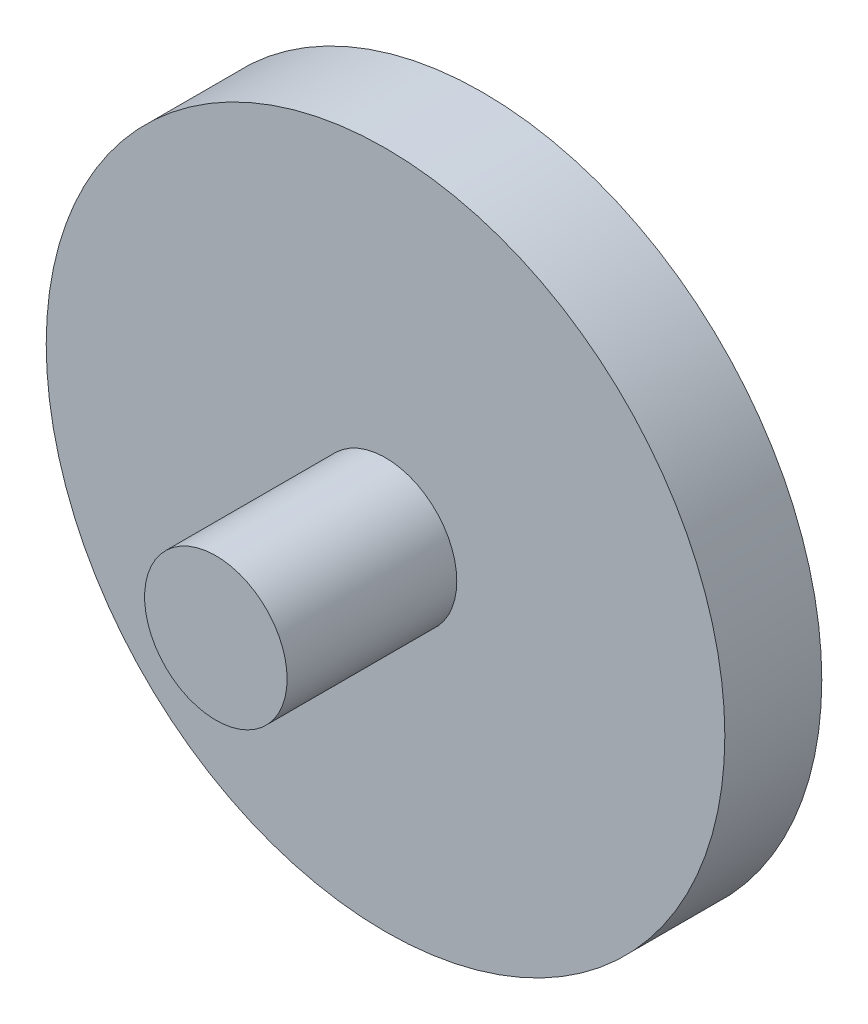
ISO-10303-21;
HEADER;
FILE_DESCRIPTION(('STEP AP214'),'2;1');
FILE_NAME('part.step','',(''),(''),'','','');
FILE_SCHEMA(('AUTOMOTIVE_DESIGN { 1 0 10303 214 1 1 1 1 }'));
ENDSEC;
DATA;
#1=APPLICATION_CONTEXT('core data for automotive mechanical design processes');
#2=APPLICATION_PROTOCOL_DEFINITION('international standard','automotive_design',2000,#1);
#3=PRODUCT_CONTEXT('',#1,'mechanical');
#4=PRODUCT('Part','Part','',(#3));
#5=PRODUCT_RELATED_PRODUCT_CATEGORY('part','',(#4));
#6=PRODUCT_DEFINITION_FORMATION('','',#4);
#7=PRODUCT_DEFINITION_CONTEXT('part definition',#1,'design');
#8=PRODUCT_DEFINITION('design','',#6,#7);
#9=PRODUCT_DEFINITION_SHAPE('','',#8);
#10=(LENGTH_UNIT() NAMED_UNIT(*) SI_UNIT(.MILLI.,.METRE.));
#11=(NAMED_UNIT(*) PLANE_ANGLE_UNIT() SI_UNIT($,.RADIAN.));
#12=(NAMED_UNIT(*) SI_UNIT($,.STERADIAN.) SOLID_ANGLE_UNIT());
#13=UNCERTAINTY_MEASURE_WITH_UNIT(LENGTH_MEASURE(1.E-05),#10,'distance_accuracy_value','');
#14=(GEOMETRIC_REPRESENTATION_CONTEXT(3) GLOBAL_UNCERTAINTY_ASSIGNED_CONTEXT((#13)) GLOBAL_UNIT_ASSIGNED_CONTEXT((#10,
#11,#12)) REPRESENTATION_CONTEXT('',''));
#15=CARTESIAN_POINT('',(0.,0.,0.));
#16=DIRECTION('',(0.,0.,1.));
#17=DIRECTION('',(1.,0.,0.));
#18=AXIS2_PLACEMENT_3D('',#15,#16,#17);
#19=CARTESIAN_POINT('',(0.,0.,4.));
#20=DIRECTION('',(0.,0.,-1.));
#21=DIRECTION('',(-1.,0.,0.));
#22=AXIS2_PLACEMENT_3D('',#19,#20,#21);
#23=CYLINDRICAL_SURFACE('',#22,14.);
#24=CARTESIAN_POINT('',(0.,0.,4.));
#25=DIRECTION('',(0.,0.,1.));
#26=DIRECTION('',(1.,0.,0.));
#27=AXIS2_PLACEMENT_3D('',#24,#25,#26);
#28=CIRCLE('',#27,14.);
#29=CARTESIAN_POINT('',(14.,0.,4.));
#30=VERTEX_POINT('',#29);
#31=EDGE_CURVE('E43',#30,#30,#28,.T.);
#32=ORIENTED_EDGE('',*,*,#31,.F.);
#33=EDGE_LOOP('',(#32));
#34=FACE_BOUND('',#33,.T.);
#35=CARTESIAN_POINT('',(0.,0.,0.));
#36=DIRECTION('',(0.,0.,1.));
#37=DIRECTION('',(1.,0.,0.));
#38=AXIS2_PLACEMENT_3D('',#35,#36,#37);
#39=CIRCLE('',#38,14.);
#40=CARTESIAN_POINT('',(14.,0.,0.));
#41=VERTEX_POINT('',#40);
#42=EDGE_CURVE('E46',#41,#41,#39,.T.);
#43=ORIENTED_EDGE('',*,*,#42,.T.);
#44=EDGE_LOOP('',(#43));
#45=FACE_BOUND('',#44,.T.);
#46=ADVANCED_FACE('F31',(#34,#45),#23,.T.);
#47=CARTESIAN_POINT('',(0.,0.,4.));
#48=DIRECTION('',(0.,0.,1.));
#49=DIRECTION('',(1.,0.,0.));
#50=AXIS2_PLACEMENT_3D('',#47,#48,#49);
#51=PLANE('',#50);
#52=CARTESIAN_POINT('',(0.,0.,4.));
#53=DIRECTION('',(0.,0.,1.));
#54=DIRECTION('',(1.,0.,0.));
#55=AXIS2_PLACEMENT_3D('',#52,#53,#54);
#56=CIRCLE('',#55,2.94);
#57=CARTESIAN_POINT('',(2.94,0.,4.));
#58=VERTEX_POINT('',#57);
#59=EDGE_CURVE('E52',#58,#58,#56,.T.);
#60=ORIENTED_EDGE('',*,*,#59,.F.);
#61=EDGE_LOOP('',(#60));
#62=FACE_BOUND('',#61,.T.);
#63=ORIENTED_EDGE('',*,*,#31,.T.);
#64=EDGE_LOOP('',(#63));
#65=FACE_BOUND('',#64,.T.);
#66=ADVANCED_FACE('F67',(#62,#65),#51,.T.);
#67=CARTESIAN_POINT('',(0.,0.,0.));
#68=DIRECTION('',(0.,0.,1.));
#69=DIRECTION('',(1.,0.,0.));
#70=AXIS2_PLACEMENT_3D('',#67,#68,#69);
#71=PLANE('',#70);
#72=CARTESIAN_POINT('',(0.,0.,0.));
#73=DIRECTION('',(0.,0.,1.));
#74=DIRECTION('',(1.,0.,0.));
#75=AXIS2_PLACEMENT_3D('',#72,#73,#74);
#76=CIRCLE('',#75,11.5);
#77=CARTESIAN_POINT('',(11.5,0.,0.));
#78=VERTEX_POINT('',#77);
#79=EDGE_CURVE('E39',#78,#78,#76,.T.);
#80=ORIENTED_EDGE('',*,*,#79,.T.);
#81=EDGE_LOOP('',(#80));
#82=FACE_BOUND('',#81,.T.);
#83=ORIENTED_EDGE('',*,*,#42,.F.);
#84=EDGE_LOOP('',(#83));
#85=FACE_BOUND('',#84,.T.);
#86=ADVANCED_FACE('F63',(#82,#85),#71,.F.);
#87=CARTESIAN_POINT('',(0.,0.,11.));
#88=DIRECTION('',(0.,0.,-1.));
#89=DIRECTION('',(-1.,0.,0.));
#90=AXIS2_PLACEMENT_3D('',#87,#88,#89);
#91=CYLINDRICAL_SURFACE('',#90,2.94);
#92=CARTESIAN_POINT('',(0.,0.,11.));
#93=DIRECTION('',(0.,0.,1.));
#94=DIRECTION('',(1.,0.,0.));
#95=AXIS2_PLACEMENT_3D('',#92,#93,#94);
#96=CIRCLE('',#95,2.94);
#97=CARTESIAN_POINT('',(2.94,0.,11.));
#98=VERTEX_POINT('',#97);
#99=EDGE_CURVE('E49',#98,#98,#96,.T.);
#100=ORIENTED_EDGE('',*,*,#99,.F.);
#101=EDGE_LOOP('',(#100));
#102=FACE_BOUND('',#101,.T.);
#103=ORIENTED_EDGE('',*,*,#59,.T.);
#104=EDGE_LOOP('',(#103));
#105=FACE_BOUND('',#104,.T.);
#106=ADVANCED_FACE('F60',(#102,#105),#91,.T.);
#107=CARTESIAN_POINT('',(0.,0.,11.));
#108=DIRECTION('',(0.,0.,1.));
#109=DIRECTION('',(1.,0.,0.));
#110=AXIS2_PLACEMENT_3D('',#107,#108,#109);
#111=PLANE('',#110);
#112=ORIENTED_EDGE('',*,*,#99,.T.);
#113=EDGE_LOOP('',(#112));
#114=FACE_BOUND('',#113,.T.);
#115=ADVANCED_FACE('F58',(#114),#111,.T.);
#116=CARTESIAN_POINT('',(0.,0.,1.));
#117=DIRECTION('',(0.,0.,-1.));
#118=DIRECTION('',(-1.,0.,0.));
#119=AXIS2_PLACEMENT_3D('',#116,#117,#118);
#120=PLANE('',#119);
#121=CARTESIAN_POINT('',(0.,0.,1.));
#122=DIRECTION('',(0.,0.,-1.));
#123=DIRECTION('',(-1.,0.,0.));
#124=AXIS2_PLACEMENT_3D('',#121,#122,#123);
#125=CIRCLE('',#124,10.5);
#126=CARTESIAN_POINT('',(-10.5,0.,1.));
#127=VERTEX_POINT('',#126);
#128=EDGE_CURVE('E10',#127,#127,#125,.T.);
#129=ORIENTED_EDGE('',*,*,#128,.T.);
#130=EDGE_LOOP('',(#129));
#131=FACE_BOUND('',#130,.T.);
#132=ADVANCED_FACE('F89',(#131),#120,.T.);
#133=CARTESIAN_POINT('',(0.,0.,0.5));
#134=DIRECTION('',(0.,0.,-1.));
#135=DIRECTION('',(-1.,0.,0.));
#136=AXIS2_PLACEMENT_3D('',#133,#134,#135);
#137=TOROIDAL_SURFACE('',#136,10.5,0.5);
#138=ORIENTED_EDGE('',*,*,#128,.F.);
#139=EDGE_LOOP('',(#138));
#140=FACE_BOUND('',#139,.T.);
#141=CARTESIAN_POINT('',(0.,0.,0.5));
#142=DIRECTION('',(0.,0.,-1.));
#143=DIRECTION('',(-1.,0.,0.));
#144=AXIS2_PLACEMENT_3D('',#141,#142,#143);
#145=CIRCLE('',#144,11.);
#146=CARTESIAN_POINT('',(-11.,0.,0.5));
#147=VERTEX_POINT('',#146);
#148=EDGE_CURVE('E35',#147,#147,#145,.F.);
#149=ORIENTED_EDGE('',*,*,#148,.F.);
#150=EDGE_LOOP('',(#149));
#151=FACE_BOUND('',#150,.T.);
#152=ADVANCED_FACE('F33',(#140,#151),#137,.F.);
#153=CARTESIAN_POINT('',(0.,0.,0.5));
#154=DIRECTION('',(0.,0.,1.));
#155=DIRECTION('',(1.,0.,0.));
#156=AXIS2_PLACEMENT_3D('',#153,#154,#155);
#157=TOROIDAL_SURFACE('',#156,11.5,0.5);
#158=ORIENTED_EDGE('',*,*,#79,.F.);
#159=EDGE_LOOP('',(#158));
#160=FACE_BOUND('',#159,.T.);
#161=ORIENTED_EDGE('',*,*,#148,.T.);
#162=EDGE_LOOP('',(#161));
#163=FACE_BOUND('',#162,.T.);
#164=ADVANCED_FACE('F83',(#160,#163),#157,.T.);
#165=CLOSED_SHELL('',(#46,#66,#86,#106,#115,#132,#152,#164));
#166=MANIFOLD_SOLID_BREP('B2',#165);
#167=ADVANCED_BREP_SHAPE_REPRESENTATION('',(#18,#166),#14);
#168=SHAPE_DEFINITION_REPRESENTATION(#9,#167);
ENDSEC;
END-ISO-10303-21;
